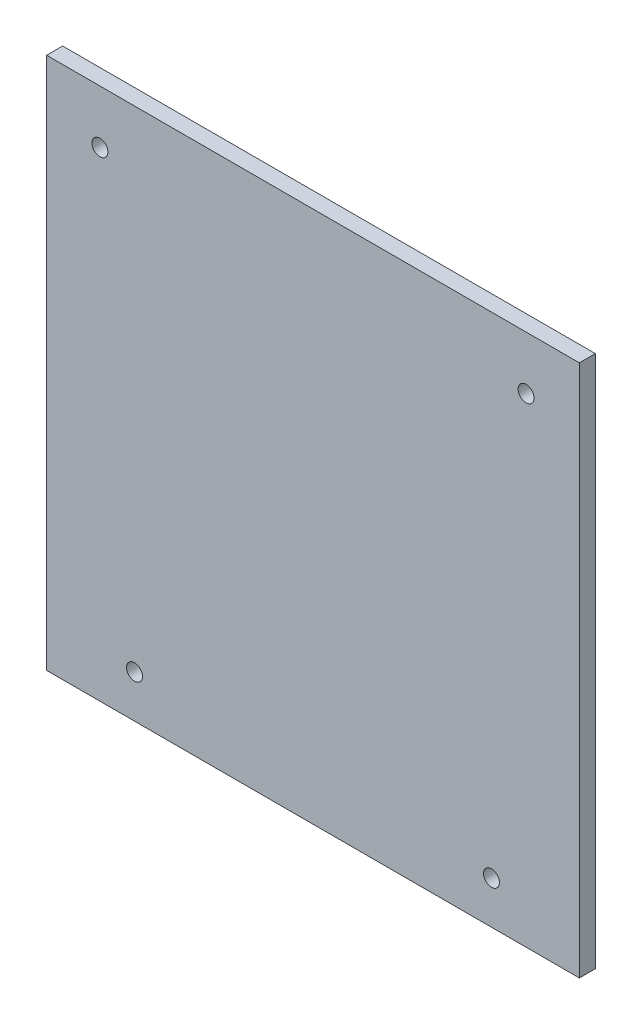
ISO-10303-21;
HEADER;
FILE_DESCRIPTION(('STEP AP214'),'2;1');
FILE_NAME('part.step','',(''),(''),'','','');
FILE_SCHEMA(('AUTOMOTIVE_DESIGN { 1 0 10303 214 1 1 1 1 }'));
ENDSEC;
DATA;
#1=APPLICATION_CONTEXT('core data for automotive mechanical design processes');
#2=APPLICATION_PROTOCOL_DEFINITION('international standard','automotive_design',2000,#1);
#3=PRODUCT_CONTEXT('',#1,'mechanical');
#4=PRODUCT('Part','Part','',(#3));
#5=PRODUCT_RELATED_PRODUCT_CATEGORY('part','',(#4));
#6=PRODUCT_DEFINITION_FORMATION('','',#4);
#7=PRODUCT_DEFINITION_CONTEXT('part definition',#1,'design');
#8=PRODUCT_DEFINITION('design','',#6,#7);
#9=PRODUCT_DEFINITION_SHAPE('','',#8);
#10=(LENGTH_UNIT() NAMED_UNIT(*) SI_UNIT(.MILLI.,.METRE.));
#11=(NAMED_UNIT(*) PLANE_ANGLE_UNIT() SI_UNIT($,.RADIAN.));
#12=(NAMED_UNIT(*) SI_UNIT($,.STERADIAN.) SOLID_ANGLE_UNIT());
#13=UNCERTAINTY_MEASURE_WITH_UNIT(LENGTH_MEASURE(1.E-05),#10,'distance_accuracy_value','');
#14=(GEOMETRIC_REPRESENTATION_CONTEXT(3) GLOBAL_UNCERTAINTY_ASSIGNED_CONTEXT((#13)) GLOBAL_UNIT_ASSIGNED_CONTEXT((#10,
#11,#12)) REPRESENTATION_CONTEXT('',''));
#15=CARTESIAN_POINT('',(0.,0.,0.));
#16=DIRECTION('',(0.,0.,1.));
#17=DIRECTION('',(1.,0.,0.));
#18=AXIS2_PLACEMENT_3D('',#15,#16,#17);
#19=CARTESIAN_POINT('',(50.,-50.,3.));
#20=DIRECTION('',(-1.,0.,0.));
#21=DIRECTION('',(0.,0.,1.));
#22=AXIS2_PLACEMENT_3D('',#19,#20,#21);
#23=PLANE('',#22);
#24=DIRECTION('',(0.,1.,0.));
#25=VECTOR('',#24,1.);
#26=CARTESIAN_POINT('',(50.,-50.,0.));
#27=LINE('',#26,#25);
#28=CARTESIAN_POINT('',(50.,-50.,0.));
#29=VERTEX_POINT('',#28);
#30=CARTESIAN_POINT('',(50.,50.,0.));
#31=VERTEX_POINT('',#30);
#32=EDGE_CURVE('E107',#29,#31,#27,.T.);
#33=ORIENTED_EDGE('',*,*,#32,.T.);
#34=DIRECTION('',(0.,0.,-1.));
#35=VECTOR('',#34,1.);
#36=CARTESIAN_POINT('',(50.,50.,3.));
#37=LINE('',#36,#35);
#38=CARTESIAN_POINT('',(50.,50.,3.));
#39=VERTEX_POINT('',#38);
#40=EDGE_CURVE('E11',#39,#31,#37,.T.);
#41=ORIENTED_EDGE('',*,*,#40,.F.);
#42=DIRECTION('',(0.,1.,0.));
#43=VECTOR('',#42,1.);
#44=CARTESIAN_POINT('',(50.,-50.,3.));
#45=LINE('',#44,#43);
#46=CARTESIAN_POINT('',(50.,-50.,3.));
#47=VERTEX_POINT('',#46);
#48=EDGE_CURVE('E91',#47,#39,#45,.T.);
#49=ORIENTED_EDGE('',*,*,#48,.F.);
#50=DIRECTION('',(0.,0.,-1.));
#51=VECTOR('',#50,1.);
#52=CARTESIAN_POINT('',(50.,-50.,3.));
#53=LINE('',#52,#51);
#54=EDGE_CURVE('E103',#47,#29,#53,.T.);
#55=ORIENTED_EDGE('',*,*,#54,.T.);
#56=EDGE_LOOP('',(#33,#41,#49,#55));
#57=FACE_BOUND('',#56,.T.);
#58=ADVANCED_FACE('F39',(#57),#23,.F.);
#59=CARTESIAN_POINT('',(-50.,50.,3.));
#60=DIRECTION('',(0.,-1.,0.));
#61=DIRECTION('',(0.,0.,-1.));
#62=AXIS2_PLACEMENT_3D('',#59,#60,#61);
#63=PLANE('',#62);
#64=DIRECTION('',(-1.,0.,0.));
#65=VECTOR('',#64,1.);
#66=CARTESIAN_POINT('',(-50.,50.,0.));
#67=LINE('',#66,#65);
#68=CARTESIAN_POINT('',(-50.,50.,0.));
#69=VERTEX_POINT('',#68);
#70=EDGE_CURVE('E96',#31,#69,#67,.T.);
#71=ORIENTED_EDGE('',*,*,#70,.T.);
#72=DIRECTION('',(0.,0.,-1.));
#73=VECTOR('',#72,1.);
#74=CARTESIAN_POINT('',(-50.,50.,3.));
#75=LINE('',#74,#73);
#76=CARTESIAN_POINT('',(-50.,50.,3.));
#77=VERTEX_POINT('',#76);
#78=EDGE_CURVE('E48',#77,#69,#75,.T.);
#79=ORIENTED_EDGE('',*,*,#78,.F.);
#80=DIRECTION('',(-1.,0.,0.));
#81=VECTOR('',#80,1.);
#82=CARTESIAN_POINT('',(-50.,50.,3.));
#83=LINE('',#82,#81);
#84=EDGE_CURVE('E86',#39,#77,#83,.T.);
#85=ORIENTED_EDGE('',*,*,#84,.F.);
#86=ORIENTED_EDGE('',*,*,#40,.T.);
#87=EDGE_LOOP('',(#71,#79,#85,#86));
#88=FACE_BOUND('',#87,.T.);
#89=ADVANCED_FACE('F95',(#88),#63,.F.);
#90=CARTESIAN_POINT('',(-50.,-50.,3.));
#91=DIRECTION('',(1.,0.,0.));
#92=DIRECTION('',(0.,0.,-1.));
#93=AXIS2_PLACEMENT_3D('',#90,#91,#92);
#94=PLANE('',#93);
#95=DIRECTION('',(0.,-1.,0.));
#96=VECTOR('',#95,1.);
#97=CARTESIAN_POINT('',(-50.,-50.,0.));
#98=LINE('',#97,#96);
#99=CARTESIAN_POINT('',(-50.,-50.,0.));
#100=VERTEX_POINT('',#99);
#101=EDGE_CURVE('E73',#69,#100,#98,.T.);
#102=ORIENTED_EDGE('',*,*,#101,.T.);
#103=DIRECTION('',(0.,0.,-1.));
#104=VECTOR('',#103,1.);
#105=CARTESIAN_POINT('',(-50.,-50.,3.));
#106=LINE('',#105,#104);
#107=CARTESIAN_POINT('',(-50.,-50.,3.));
#108=VERTEX_POINT('',#107);
#109=EDGE_CURVE('E98',#108,#100,#106,.T.);
#110=ORIENTED_EDGE('',*,*,#109,.F.);
#111=DIRECTION('',(0.,-1.,0.));
#112=VECTOR('',#111,1.);
#113=CARTESIAN_POINT('',(-50.,-50.,3.));
#114=LINE('',#113,#112);
#115=EDGE_CURVE('E89',#77,#108,#114,.T.);
#116=ORIENTED_EDGE('',*,*,#115,.F.);
#117=ORIENTED_EDGE('',*,*,#78,.T.);
#118=EDGE_LOOP('',(#102,#110,#116,#117));
#119=FACE_BOUND('',#118,.T.);
#120=ADVANCED_FACE('F99',(#119),#94,.F.);
#121=CARTESIAN_POINT('',(-50.,-50.,3.));
#122=DIRECTION('',(0.,1.,0.));
#123=DIRECTION('',(0.,0.,1.));
#124=AXIS2_PLACEMENT_3D('',#121,#122,#123);
#125=PLANE('',#124);
#126=DIRECTION('',(1.,0.,0.));
#127=VECTOR('',#126,1.);
#128=CARTESIAN_POINT('',(-50.,-50.,0.));
#129=LINE('',#128,#127);
#130=EDGE_CURVE('E79',#100,#29,#129,.T.);
#131=ORIENTED_EDGE('',*,*,#130,.T.);
#132=ORIENTED_EDGE('',*,*,#54,.F.);
#133=DIRECTION('',(1.,0.,0.));
#134=VECTOR('',#133,1.);
#135=CARTESIAN_POINT('',(-50.,-50.,3.));
#136=LINE('',#135,#134);
#137=EDGE_CURVE('E56',#108,#47,#136,.T.);
#138=ORIENTED_EDGE('',*,*,#137,.F.);
#139=ORIENTED_EDGE('',*,*,#109,.T.);
#140=EDGE_LOOP('',(#131,#132,#138,#139));
#141=FACE_BOUND('',#140,.T.);
#142=ADVANCED_FACE('F121',(#141),#125,.F.);
#143=CARTESIAN_POINT('',(0.,0.,3.));
#144=DIRECTION('',(0.,0.,-1.));
#145=DIRECTION('',(-1.,0.,0.));
#146=AXIS2_PLACEMENT_3D('',#143,#144,#145);
#147=PLANE('',#146);
#148=CARTESIAN_POINT('',(-40.,40.,3.));
#149=DIRECTION('',(0.,0.,1.));
#150=DIRECTION('',(1.,0.,0.));
#151=AXIS2_PLACEMENT_3D('',#148,#149,#150);
#152=CIRCLE('',#151,1.5);
#153=CARTESIAN_POINT('',(-38.5,40.,3.));
#154=VERTEX_POINT('',#153);
#155=EDGE_CURVE('E152',#154,#154,#152,.T.);
#156=ORIENTED_EDGE('',*,*,#155,.F.);
#157=EDGE_LOOP('',(#156));
#158=FACE_BOUND('',#157,.T.);
#159=CARTESIAN_POINT('',(33.5,-42.,3.));
#160=DIRECTION('',(0.,0.,1.));
#161=DIRECTION('',(-1.,0.,0.));
#162=AXIS2_PLACEMENT_3D('',#159,#160,#161);
#163=CIRCLE('',#162,1.5);
#164=CARTESIAN_POINT('',(32.,-42.,3.));
#165=VERTEX_POINT('',#164);
#166=EDGE_CURVE('E144',#165,#165,#163,.T.);
#167=ORIENTED_EDGE('',*,*,#166,.F.);
#168=EDGE_LOOP('',(#167));
#169=FACE_BOUND('',#168,.T.);
#170=CARTESIAN_POINT('',(-33.5,-42.,3.));
#171=DIRECTION('',(0.,0.,1.));
#172=DIRECTION('',(1.,0.,0.));
#173=AXIS2_PLACEMENT_3D('',#170,#171,#172);
#174=CIRCLE('',#173,1.5);
#175=CARTESIAN_POINT('',(-32.,-42.,3.));
#176=VERTEX_POINT('',#175);
#177=EDGE_CURVE('E136',#176,#176,#174,.T.);
#178=ORIENTED_EDGE('',*,*,#177,.F.);
#179=EDGE_LOOP('',(#178));
#180=FACE_BOUND('',#179,.T.);
#181=CARTESIAN_POINT('',(40.,40.,3.));
#182=DIRECTION('',(0.,0.,1.));
#183=DIRECTION('',(-1.,0.,0.));
#184=AXIS2_PLACEMENT_3D('',#181,#182,#183);
#185=CIRCLE('',#184,1.5);
#186=CARTESIAN_POINT('',(38.5,40.,3.));
#187=VERTEX_POINT('',#186);
#188=EDGE_CURVE('E128',#187,#187,#185,.T.);
#189=ORIENTED_EDGE('',*,*,#188,.F.);
#190=EDGE_LOOP('',(#189));
#191=FACE_BOUND('',#190,.T.);
#192=ORIENTED_EDGE('',*,*,#48,.T.);
#193=ORIENTED_EDGE('',*,*,#84,.T.);
#194=ORIENTED_EDGE('',*,*,#115,.T.);
#195=ORIENTED_EDGE('',*,*,#137,.T.);
#196=EDGE_LOOP('',(#192,#193,#194,#195));
#197=FACE_BOUND('',#196,.T.);
#198=ADVANCED_FACE('F87',(#158,#169,#180,#191,#197),#147,.F.);
#199=CARTESIAN_POINT('',(0.,0.,0.));
#200=DIRECTION('',(0.,0.,-1.));
#201=DIRECTION('',(-1.,0.,0.));
#202=AXIS2_PLACEMENT_3D('',#199,#200,#201);
#203=PLANE('',#202);
#204=CARTESIAN_POINT('',(-40.,40.,0.));
#205=DIRECTION('',(0.,0.,1.));
#206=DIRECTION('',(1.,0.,0.));
#207=AXIS2_PLACEMENT_3D('',#204,#205,#206);
#208=CIRCLE('',#207,1.5);
#209=CARTESIAN_POINT('',(-38.5,40.,0.));
#210=VERTEX_POINT('',#209);
#211=EDGE_CURVE('E111',#210,#210,#208,.T.);
#212=ORIENTED_EDGE('',*,*,#211,.T.);
#213=EDGE_LOOP('',(#212));
#214=FACE_BOUND('',#213,.T.);
#215=CARTESIAN_POINT('',(33.5,-42.,0.));
#216=DIRECTION('',(0.,0.,1.));
#217=DIRECTION('',(-1.,0.,0.));
#218=AXIS2_PLACEMENT_3D('',#215,#216,#217);
#219=CIRCLE('',#218,1.5);
#220=CARTESIAN_POINT('',(32.,-42.,0.));
#221=VERTEX_POINT('',#220);
#222=EDGE_CURVE('E148',#221,#221,#219,.T.);
#223=ORIENTED_EDGE('',*,*,#222,.T.);
#224=EDGE_LOOP('',(#223));
#225=FACE_BOUND('',#224,.T.);
#226=CARTESIAN_POINT('',(-33.5,-42.,0.));
#227=DIRECTION('',(0.,0.,1.));
#228=DIRECTION('',(1.,0.,0.));
#229=AXIS2_PLACEMENT_3D('',#226,#227,#228);
#230=CIRCLE('',#229,1.5);
#231=CARTESIAN_POINT('',(-32.,-42.,0.));
#232=VERTEX_POINT('',#231);
#233=EDGE_CURVE('E140',#232,#232,#230,.T.);
#234=ORIENTED_EDGE('',*,*,#233,.T.);
#235=EDGE_LOOP('',(#234));
#236=FACE_BOUND('',#235,.T.);
#237=CARTESIAN_POINT('',(40.,40.,0.));
#238=DIRECTION('',(0.,0.,1.));
#239=DIRECTION('',(-1.,0.,0.));
#240=AXIS2_PLACEMENT_3D('',#237,#238,#239);
#241=CIRCLE('',#240,1.5);
#242=CARTESIAN_POINT('',(38.5,40.,0.));
#243=VERTEX_POINT('',#242);
#244=EDGE_CURVE('E132',#243,#243,#241,.T.);
#245=ORIENTED_EDGE('',*,*,#244,.T.);
#246=EDGE_LOOP('',(#245));
#247=FACE_BOUND('',#246,.T.);
#248=ORIENTED_EDGE('',*,*,#32,.F.);
#249=ORIENTED_EDGE('',*,*,#130,.F.);
#250=ORIENTED_EDGE('',*,*,#101,.F.);
#251=ORIENTED_EDGE('',*,*,#70,.F.);
#252=EDGE_LOOP('',(#248,#249,#250,#251));
#253=FACE_BOUND('',#252,.T.);
#254=ADVANCED_FACE('F124',(#214,#225,#236,#247,#253),#203,.T.);
#255=CARTESIAN_POINT('',(40.,40.,0.));
#256=DIRECTION('',(0.,0.,1.));
#257=DIRECTION('',(1.,0.,0.));
#258=AXIS2_PLACEMENT_3D('',#255,#256,#257);
#259=CYLINDRICAL_SURFACE('',#258,1.5);
#260=ORIENTED_EDGE('',*,*,#244,.F.);
#261=EDGE_LOOP('',(#260));
#262=FACE_BOUND('',#261,.T.);
#263=ORIENTED_EDGE('',*,*,#188,.T.);
#264=EDGE_LOOP('',(#263));
#265=FACE_BOUND('',#264,.T.);
#266=ADVANCED_FACE('F178',(#262,#265),#259,.F.);
#267=CARTESIAN_POINT('',(-33.5,-42.,0.));
#268=DIRECTION('',(0.,0.,1.));
#269=DIRECTION('',(1.,0.,0.));
#270=AXIS2_PLACEMENT_3D('',#267,#268,#269);
#271=CYLINDRICAL_SURFACE('',#270,1.5);
#272=ORIENTED_EDGE('',*,*,#233,.F.);
#273=EDGE_LOOP('',(#272));
#274=FACE_BOUND('',#273,.T.);
#275=ORIENTED_EDGE('',*,*,#177,.T.);
#276=EDGE_LOOP('',(#275));
#277=FACE_BOUND('',#276,.T.);
#278=ADVANCED_FACE('F180',(#274,#277),#271,.F.);
#279=CARTESIAN_POINT('',(33.5,-42.,0.));
#280=DIRECTION('',(0.,0.,1.));
#281=DIRECTION('',(1.,0.,0.));
#282=AXIS2_PLACEMENT_3D('',#279,#280,#281);
#283=CYLINDRICAL_SURFACE('',#282,1.5);
#284=ORIENTED_EDGE('',*,*,#222,.F.);
#285=EDGE_LOOP('',(#284));
#286=FACE_BOUND('',#285,.T.);
#287=ORIENTED_EDGE('',*,*,#166,.T.);
#288=EDGE_LOOP('',(#287));
#289=FACE_BOUND('',#288,.T.);
#290=ADVANCED_FACE('F165',(#286,#289),#283,.F.);
#291=CARTESIAN_POINT('',(-40.,40.,0.));
#292=DIRECTION('',(0.,0.,1.));
#293=DIRECTION('',(1.,0.,0.));
#294=AXIS2_PLACEMENT_3D('',#291,#292,#293);
#295=CYLINDRICAL_SURFACE('',#294,1.5);
#296=ORIENTED_EDGE('',*,*,#211,.F.);
#297=EDGE_LOOP('',(#296));
#298=FACE_BOUND('',#297,.T.);
#299=ORIENTED_EDGE('',*,*,#155,.T.);
#300=EDGE_LOOP('',(#299));
#301=FACE_BOUND('',#300,.T.);
#302=ADVANCED_FACE('F162',(#298,#301),#295,.F.);
#303=CLOSED_SHELL('',(#58,#89,#120,#142,#198,#254,#266,#278,#290,#302));
#304=MANIFOLD_SOLID_BREP('B2',#303);
#305=ADVANCED_BREP_SHAPE_REPRESENTATION('',(#18,#304),#14);
#306=SHAPE_DEFINITION_REPRESENTATION(#9,#305);
ENDSEC;
END-ISO-10303-21;
